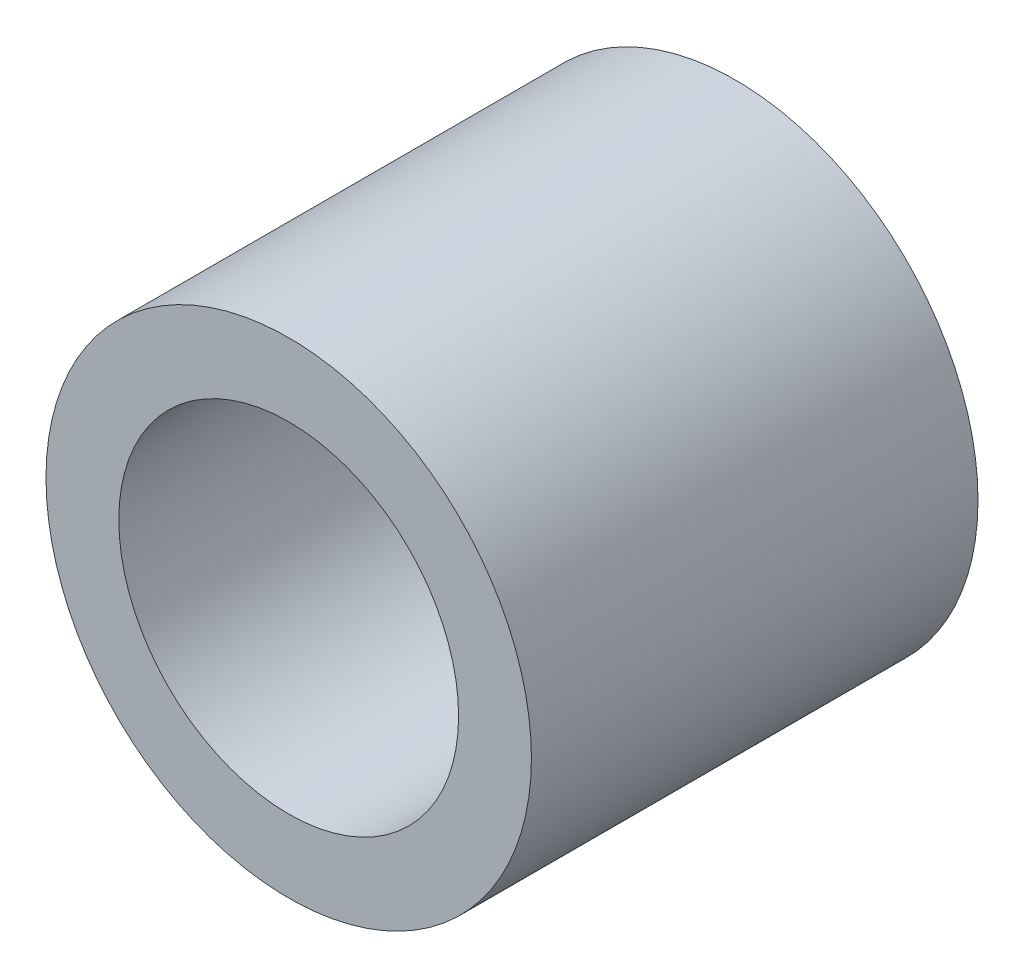
ISO-10303-21;
HEADER;
FILE_DESCRIPTION(('STEP AP214'),'2;1');
FILE_NAME('part.step','',(''),(''),'','','');
FILE_SCHEMA(('AUTOMOTIVE_DESIGN { 1 0 10303 214 1 1 1 1 }'));
ENDSEC;
DATA;
#1=APPLICATION_CONTEXT('core data for automotive mechanical design processes');
#2=APPLICATION_PROTOCOL_DEFINITION('international standard','automotive_design',2000,#1);
#3=PRODUCT_CONTEXT('',#1,'mechanical');
#4=PRODUCT('Part','Part','',(#3));
#5=PRODUCT_RELATED_PRODUCT_CATEGORY('part','',(#4));
#6=PRODUCT_DEFINITION_FORMATION('','',#4);
#7=PRODUCT_DEFINITION_CONTEXT('part definition',#1,'design');
#8=PRODUCT_DEFINITION('design','',#6,#7);
#9=PRODUCT_DEFINITION_SHAPE('','',#8);
#10=(LENGTH_UNIT() NAMED_UNIT(*) SI_UNIT(.MILLI.,.METRE.));
#11=(NAMED_UNIT(*) PLANE_ANGLE_UNIT() SI_UNIT($,.RADIAN.));
#12=(NAMED_UNIT(*) SI_UNIT($,.STERADIAN.) SOLID_ANGLE_UNIT());
#13=UNCERTAINTY_MEASURE_WITH_UNIT(LENGTH_MEASURE(1.E-05),#10,'distance_accuracy_value','');
#14=(GEOMETRIC_REPRESENTATION_CONTEXT(3) GLOBAL_UNCERTAINTY_ASSIGNED_CONTEXT((#13)) GLOBAL_UNIT_ASSIGNED_CONTEXT((#10,
#11,#12)) REPRESENTATION_CONTEXT('',''));
#15=CARTESIAN_POINT('',(0.,0.,0.));
#16=DIRECTION('',(0.,0.,1.));
#17=DIRECTION('',(1.,0.,0.));
#18=AXIS2_PLACEMENT_3D('',#15,#16,#17);
#19=CARTESIAN_POINT('',(0.,0.,4.6));
#20=DIRECTION('',(0.,0.,1.));
#21=DIRECTION('',(1.,0.,0.));
#22=AXIS2_PLACEMENT_3D('',#19,#20,#21);
#23=PLANE('',#22);
#24=CARTESIAN_POINT('',(0.,0.,4.6));
#25=DIRECTION('',(0.,0.,1.));
#26=DIRECTION('',(1.,0.,0.));
#27=AXIS2_PLACEMENT_3D('',#24,#25,#26);
#28=CIRCLE('',#27,2.5);
#29=CARTESIAN_POINT('',(2.5,0.,4.6));
#30=VERTEX_POINT('',#29);
#31=EDGE_CURVE('E10',#30,#30,#28,.T.);
#32=ORIENTED_EDGE('',*,*,#31,.T.);
#33=EDGE_LOOP('',(#32));
#34=FACE_BOUND('',#33,.T.);
#35=CARTESIAN_POINT('',(0.,0.,4.6));
#36=DIRECTION('',(0.,0.,1.));
#37=DIRECTION('',(1.,0.,0.));
#38=AXIS2_PLACEMENT_3D('',#35,#36,#37);
#39=CIRCLE('',#38,1.75);
#40=CARTESIAN_POINT('',(1.75,0.,4.6));
#41=VERTEX_POINT('',#40);
#42=EDGE_CURVE('E43',#41,#41,#39,.T.);
#43=ORIENTED_EDGE('',*,*,#42,.F.);
#44=EDGE_LOOP('',(#43));
#45=FACE_BOUND('',#44,.T.);
#46=ADVANCED_FACE('F32',(#34,#45),#23,.T.);
#47=CARTESIAN_POINT('',(0.,0.,0.));
#48=DIRECTION('',(0.,0.,1.));
#49=DIRECTION('',(1.,0.,0.));
#50=AXIS2_PLACEMENT_3D('',#47,#48,#49);
#51=PLANE('',#50);
#52=CARTESIAN_POINT('',(0.,0.,0.));
#53=DIRECTION('',(0.,0.,1.));
#54=DIRECTION('',(1.,0.,0.));
#55=AXIS2_PLACEMENT_3D('',#52,#53,#54);
#56=CIRCLE('',#55,2.5);
#57=CARTESIAN_POINT('',(2.5,0.,0.));
#58=VERTEX_POINT('',#57);
#59=EDGE_CURVE('E36',#58,#58,#56,.T.);
#60=ORIENTED_EDGE('',*,*,#59,.F.);
#61=EDGE_LOOP('',(#60));
#62=FACE_BOUND('',#61,.T.);
#63=CARTESIAN_POINT('',(0.,0.,0.));
#64=DIRECTION('',(0.,0.,1.));
#65=DIRECTION('',(1.,0.,0.));
#66=AXIS2_PLACEMENT_3D('',#63,#64,#65);
#67=CIRCLE('',#66,1.75);
#68=CARTESIAN_POINT('',(1.75,0.,0.));
#69=VERTEX_POINT('',#68);
#70=EDGE_CURVE('E45',#69,#69,#67,.T.);
#71=ORIENTED_EDGE('',*,*,#70,.T.);
#72=EDGE_LOOP('',(#71));
#73=FACE_BOUND('',#72,.T.);
#74=ADVANCED_FACE('F55',(#62,#73),#51,.F.);
#75=CARTESIAN_POINT('',(0.,0.,4.6));
#76=DIRECTION('',(0.,0.,-1.));
#77=DIRECTION('',(-1.,0.,0.));
#78=AXIS2_PLACEMENT_3D('',#75,#76,#77);
#79=CYLINDRICAL_SURFACE('',#78,2.5);
#80=ORIENTED_EDGE('',*,*,#31,.F.);
#81=EDGE_LOOP('',(#80));
#82=FACE_BOUND('',#81,.T.);
#83=ORIENTED_EDGE('',*,*,#59,.T.);
#84=EDGE_LOOP('',(#83));
#85=FACE_BOUND('',#84,.T.);
#86=ADVANCED_FACE('F34',(#82,#85),#79,.T.);
#87=CARTESIAN_POINT('',(0.,0.,4.6));
#88=DIRECTION('',(0.,0.,-1.));
#89=DIRECTION('',(-1.,0.,0.));
#90=AXIS2_PLACEMENT_3D('',#87,#88,#89);
#91=CYLINDRICAL_SURFACE('',#90,1.75);
#92=ORIENTED_EDGE('',*,*,#42,.T.);
#93=EDGE_LOOP('',(#92));
#94=FACE_BOUND('',#93,.T.);
#95=ORIENTED_EDGE('',*,*,#70,.F.);
#96=EDGE_LOOP('',(#95));
#97=FACE_BOUND('',#96,.T.);
#98=ADVANCED_FACE('F51',(#94,#97),#91,.F.);
#99=CLOSED_SHELL('',(#46,#74,#86,#98));
#100=MANIFOLD_SOLID_BREP('B2',#99);
#101=ADVANCED_BREP_SHAPE_REPRESENTATION('',(#18,#100),#14);
#102=SHAPE_DEFINITION_REPRESENTATION(#9,#101);
ENDSEC;
END-ISO-10303-21;
